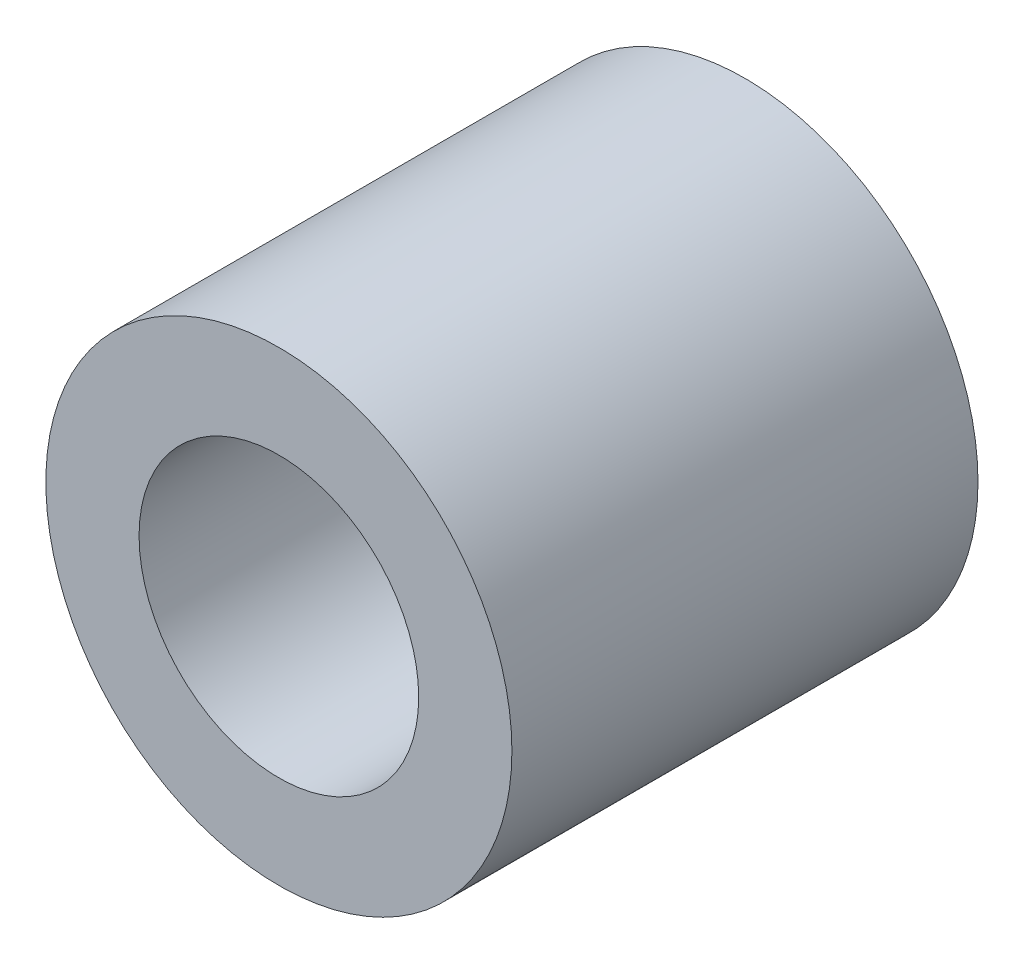
ISO-10303-21;
HEADER;
FILE_DESCRIPTION(('STEP AP214'),'2;1');
FILE_NAME('part.step','',(''),(''),'','','');
FILE_SCHEMA(('AUTOMOTIVE_DESIGN { 1 0 10303 214 1 1 1 1 }'));
ENDSEC;
DATA;
#1=APPLICATION_CONTEXT('core data for automotive mechanical design processes');
#2=APPLICATION_PROTOCOL_DEFINITION('international standard','automotive_design',2000,#1);
#3=PRODUCT_CONTEXT('',#1,'mechanical');
#4=PRODUCT('Part','Part','',(#3));
#5=PRODUCT_RELATED_PRODUCT_CATEGORY('part','',(#4));
#6=PRODUCT_DEFINITION_FORMATION('','',#4);
#7=PRODUCT_DEFINITION_CONTEXT('part definition',#1,'design');
#8=PRODUCT_DEFINITION('design','',#6,#7);
#9=PRODUCT_DEFINITION_SHAPE('','',#8);
#10=(LENGTH_UNIT() NAMED_UNIT(*) SI_UNIT(.MILLI.,.METRE.));
#11=(NAMED_UNIT(*) PLANE_ANGLE_UNIT() SI_UNIT($,.RADIAN.));
#12=(NAMED_UNIT(*) SI_UNIT($,.STERADIAN.) SOLID_ANGLE_UNIT());
#13=UNCERTAINTY_MEASURE_WITH_UNIT(LENGTH_MEASURE(1.E-05),#10,'distance_accuracy_value','');
#14=(GEOMETRIC_REPRESENTATION_CONTEXT(3) GLOBAL_UNCERTAINTY_ASSIGNED_CONTEXT((#13)) GLOBAL_UNIT_ASSIGNED_CONTEXT((#10,
#11,#12)) REPRESENTATION_CONTEXT('',''));
#15=CARTESIAN_POINT('',(0.,0.,0.));
#16=DIRECTION('',(0.,0.,1.));
#17=DIRECTION('',(1.,0.,0.));
#18=AXIS2_PLACEMENT_3D('',#15,#16,#17);
#19=CARTESIAN_POINT('',(0.,0.,10.));
#20=DIRECTION('',(0.,0.,1.));
#21=DIRECTION('',(1.,0.,0.));
#22=AXIS2_PLACEMENT_3D('',#19,#20,#21);
#23=PLANE('',#22);
#24=CARTESIAN_POINT('',(0.,0.,10.));
#25=DIRECTION('',(0.,0.,1.));
#26=DIRECTION('',(1.,0.,0.));
#27=AXIS2_PLACEMENT_3D('',#24,#25,#26);
#28=CIRCLE('',#27,5.);
#29=CARTESIAN_POINT('',(5.,0.,10.));
#30=VERTEX_POINT('',#29);
#31=EDGE_CURVE('E10',#30,#30,#28,.T.);
#32=ORIENTED_EDGE('',*,*,#31,.T.);
#33=EDGE_LOOP('',(#32));
#34=FACE_BOUND('',#33,.T.);
#35=CARTESIAN_POINT('',(0.,0.,10.));
#36=DIRECTION('',(0.,0.,1.));
#37=DIRECTION('',(1.,0.,0.));
#38=AXIS2_PLACEMENT_3D('',#35,#36,#37);
#39=CIRCLE('',#38,3.);
#40=CARTESIAN_POINT('',(3.,0.,10.));
#41=VERTEX_POINT('',#40);
#42=EDGE_CURVE('E40',#41,#41,#39,.T.);
#43=ORIENTED_EDGE('',*,*,#42,.F.);
#44=EDGE_LOOP('',(#43));
#45=FACE_BOUND('',#44,.T.);
#46=ADVANCED_FACE('F29',(#34,#45),#23,.T.);
#47=CARTESIAN_POINT('',(0.,0.,0.));
#48=DIRECTION('',(0.,0.,1.));
#49=DIRECTION('',(1.,0.,0.));
#50=AXIS2_PLACEMENT_3D('',#47,#48,#49);
#51=PLANE('',#50);
#52=CARTESIAN_POINT('',(0.,0.,0.));
#53=DIRECTION('',(0.,0.,1.));
#54=DIRECTION('',(1.,0.,0.));
#55=AXIS2_PLACEMENT_3D('',#52,#53,#54);
#56=CIRCLE('',#55,5.);
#57=CARTESIAN_POINT('',(5.,0.,0.));
#58=VERTEX_POINT('',#57);
#59=EDGE_CURVE('E33',#58,#58,#56,.T.);
#60=ORIENTED_EDGE('',*,*,#59,.F.);
#61=EDGE_LOOP('',(#60));
#62=FACE_BOUND('',#61,.T.);
#63=CARTESIAN_POINT('',(0.,0.,0.));
#64=DIRECTION('',(0.,0.,1.));
#65=DIRECTION('',(1.,0.,0.));
#66=AXIS2_PLACEMENT_3D('',#63,#64,#65);
#67=CIRCLE('',#66,3.);
#68=CARTESIAN_POINT('',(3.,0.,0.));
#69=VERTEX_POINT('',#68);
#70=EDGE_CURVE('E42',#69,#69,#67,.T.);
#71=ORIENTED_EDGE('',*,*,#70,.T.);
#72=EDGE_LOOP('',(#71));
#73=FACE_BOUND('',#72,.T.);
#74=ADVANCED_FACE('F52',(#62,#73),#51,.F.);
#75=CARTESIAN_POINT('',(0.,0.,10.));
#76=DIRECTION('',(0.,0.,-1.));
#77=DIRECTION('',(-1.,0.,0.));
#78=AXIS2_PLACEMENT_3D('',#75,#76,#77);
#79=CYLINDRICAL_SURFACE('',#78,5.);
#80=ORIENTED_EDGE('',*,*,#31,.F.);
#81=EDGE_LOOP('',(#80));
#82=FACE_BOUND('',#81,.T.);
#83=ORIENTED_EDGE('',*,*,#59,.T.);
#84=EDGE_LOOP('',(#83));
#85=FACE_BOUND('',#84,.T.);
#86=ADVANCED_FACE('F31',(#82,#85),#79,.T.);
#87=CARTESIAN_POINT('',(0.,0.,10.));
#88=DIRECTION('',(0.,0.,-1.));
#89=DIRECTION('',(-1.,0.,0.));
#90=AXIS2_PLACEMENT_3D('',#87,#88,#89);
#91=CYLINDRICAL_SURFACE('',#90,3.);
#92=ORIENTED_EDGE('',*,*,#42,.T.);
#93=EDGE_LOOP('',(#92));
#94=FACE_BOUND('',#93,.T.);
#95=ORIENTED_EDGE('',*,*,#70,.F.);
#96=EDGE_LOOP('',(#95));
#97=FACE_BOUND('',#96,.T.);
#98=ADVANCED_FACE('F48',(#94,#97),#91,.F.);
#99=CLOSED_SHELL('',(#46,#74,#86,#98));
#100=MANIFOLD_SOLID_BREP('B2',#99);
#101=ADVANCED_BREP_SHAPE_REPRESENTATION('',(#18,#100),#14);
#102=SHAPE_DEFINITION_REPRESENTATION(#9,#101);
ENDSEC;
END-ISO-10303-21;
